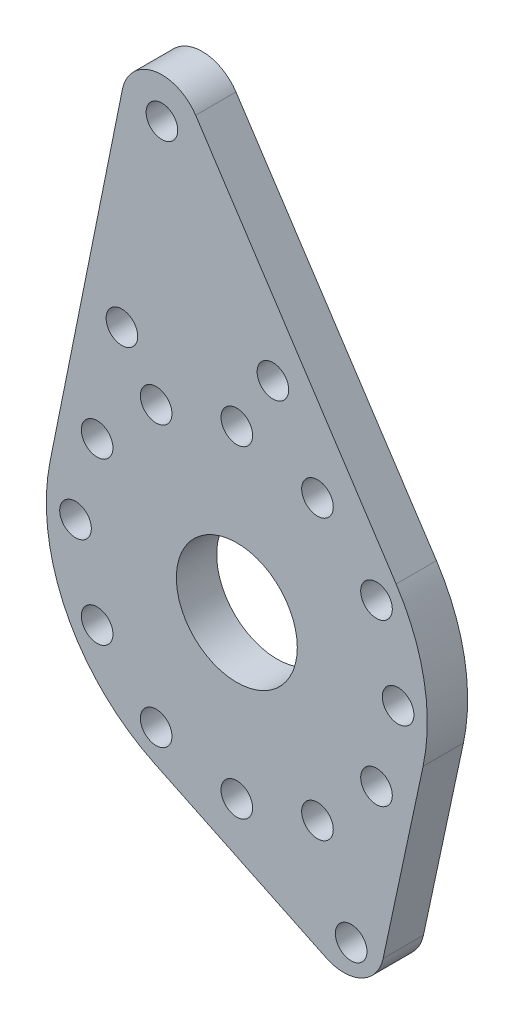
ISO-10303-21;
HEADER;
FILE_DESCRIPTION(('STEP AP214'),'2;1');
FILE_NAME('part.step','',(''),(''),'','','');
FILE_SCHEMA(('AUTOMOTIVE_DESIGN { 1 0 10303 214 1 1 1 1 }'));
ENDSEC;
DATA;
#1=APPLICATION_CONTEXT('core data for automotive mechanical design processes');
#2=APPLICATION_PROTOCOL_DEFINITION('international standard','automotive_design',2000,#1);
#3=PRODUCT_CONTEXT('',#1,'mechanical');
#4=PRODUCT('Part','Part','',(#3));
#5=PRODUCT_RELATED_PRODUCT_CATEGORY('part','',(#4));
#6=PRODUCT_DEFINITION_FORMATION('','',#4);
#7=PRODUCT_DEFINITION_CONTEXT('part definition',#1,'design');
#8=PRODUCT_DEFINITION('design','',#6,#7);
#9=PRODUCT_DEFINITION_SHAPE('','',#8);
#10=(LENGTH_UNIT() NAMED_UNIT(*) SI_UNIT(.MILLI.,.METRE.));
#11=(NAMED_UNIT(*) PLANE_ANGLE_UNIT() SI_UNIT($,.RADIAN.));
#12=(NAMED_UNIT(*) SI_UNIT($,.STERADIAN.) SOLID_ANGLE_UNIT());
#13=UNCERTAINTY_MEASURE_WITH_UNIT(LENGTH_MEASURE(1.E-05),#10,'distance_accuracy_value','');
#14=(GEOMETRIC_REPRESENTATION_CONTEXT(3) GLOBAL_UNCERTAINTY_ASSIGNED_CONTEXT((#13)) GLOBAL_UNIT_ASSIGNED_CONTEXT((#10,
#11,#12)) REPRESENTATION_CONTEXT('',''));
#15=CARTESIAN_POINT('',(0.,0.,0.));
#16=DIRECTION('',(0.,0.,1.));
#17=DIRECTION('',(1.,0.,0.));
#18=AXIS2_PLACEMENT_3D('',#15,#16,#17);
#19=CARTESIAN_POINT('',(323.538944933559,322.723784492421,6.35));
#20=DIRECTION('',(0.,0.,-1.));
#21=DIRECTION('',(-1.,0.,0.));
#22=AXIS2_PLACEMENT_3D('',#19,#20,#21);
#23=CYLINDRICAL_SURFACE('',#22,29.999999944);
#24=CARTESIAN_POINT('',(323.538944933559,322.723784492421,0.));
#25=DIRECTION('',(0.,0.,1.));
#26=DIRECTION('',(1.,0.,0.));
#27=AXIS2_PLACEMENT_3D('',#24,#25,#26);
#28=CIRCLE('',#27,29.999999944);
#29=CARTESIAN_POINT('',(352.872493449817,316.435467699804,0.));
#30=VERTEX_POINT('',#29);
#31=CARTESIAN_POINT('',(348.62500866221,339.176425716312,0.));
#32=VERTEX_POINT('',#31);
#33=EDGE_CURVE('E122',#30,#32,#28,.T.);
#34=ORIENTED_EDGE('',*,*,#33,.T.);
#35=DIRECTION('',(0.,0.,-1.));
#36=VECTOR('',#35,1.);
#37=CARTESIAN_POINT('',(348.62500866221,339.176425716312,6.35));
#38=LINE('',#37,#36);
#39=CARTESIAN_POINT('',(348.62500866221,339.176425716312,6.35));
#40=VERTEX_POINT('',#39);
#41=EDGE_CURVE('E105',#40,#32,#38,.T.);
#42=ORIENTED_EDGE('',*,*,#41,.F.);
#43=CARTESIAN_POINT('',(323.538944933559,322.723784492421,6.35));
#44=DIRECTION('',(0.,0.,1.));
#45=DIRECTION('',(1.,0.,0.));
#46=AXIS2_PLACEMENT_3D('',#43,#44,#45);
#47=CIRCLE('',#46,29.999999944);
#48=CARTESIAN_POINT('',(352.872493449817,316.435467699804,6.35));
#49=VERTEX_POINT('',#48);
#50=EDGE_CURVE('E108',#49,#40,#47,.T.);
#51=ORIENTED_EDGE('',*,*,#50,.F.);
#52=DIRECTION('',(0.,0.,-1.));
#53=VECTOR('',#52,1.);
#54=CARTESIAN_POINT('',(352.872493449817,316.435467699804,6.35));
#55=LINE('',#54,#53);
#56=EDGE_CURVE('E179',#49,#30,#55,.T.);
#57=ORIENTED_EDGE('',*,*,#56,.T.);
#58=EDGE_LOOP('',(#34,#42,#51,#57));
#59=FACE_BOUND('',#58,.T.);
#60=ADVANCED_FACE('F39',(#59),#23,.T.);
#61=CARTESIAN_POINT('',(399.313754526558,261.889071559946,6.35));
#62=DIRECTION('',(-0.836202125849281,-0.548421375153398,0.));
#63=DIRECTION('',(0.548421375153398,-0.836202125849281,0.));
#64=AXIS2_PLACEMENT_3D('',#61,#62,#63);
#65=PLANE('',#64);
#66=DIRECTION('',(-0.548421375153398,0.836202125849281,0.));
#67=VECTOR('',#66,1.);
#68=CARTESIAN_POINT('',(399.313754526558,261.889071559946,0.));
#69=LINE('',#68,#67);
#70=CARTESIAN_POINT('',(317.053464102312,387.314944514831,0.));
#71=VERTEX_POINT('',#70);
#72=EDGE_CURVE('E156',#32,#71,#69,.T.);
#73=ORIENTED_EDGE('',*,*,#72,.T.);
#74=DIRECTION('',(0.,0.,-1.));
#75=VECTOR('',#74,1.);
#76=CARTESIAN_POINT('',(317.053464102312,387.314944514831,6.35));
#77=LINE('',#76,#75);
#78=CARTESIAN_POINT('',(317.053464102312,387.314944514831,6.35));
#79=VERTEX_POINT('',#78);
#80=EDGE_CURVE('E11',#71,#79,#77,.F.);
#81=ORIENTED_EDGE('',*,*,#80,.T.);
#82=DIRECTION('',(-0.548421375153398,0.836202125849281,0.));
#83=VECTOR('',#82,1.);
#84=CARTESIAN_POINT('',(399.313754526558,261.889071559946,6.35));
#85=LINE('',#84,#83);
#86=EDGE_CURVE('E101',#40,#79,#85,.T.);
#87=ORIENTED_EDGE('',*,*,#86,.F.);
#88=ORIENTED_EDGE('',*,*,#41,.T.);
#89=EDGE_LOOP('',(#73,#81,#87,#88));
#90=FACE_BOUND('',#89,.T.);
#91=ADVANCED_FACE('F103',(#90),#65,.F.);
#92=CARTESIAN_POINT('',(218.896925037222,-44.1720425692418,6.35));
#93=DIRECTION('',(0.980241072412843,-0.197806572072113,0.));
#94=DIRECTION('',(0.197806572072113,0.980241072412843,0.));
#95=AXIS2_PLACEMENT_3D('',#92,#93,#94);
#96=PLANE('',#95);
#97=DIRECTION('',(-0.197806572072113,-0.980241072412843,0.));
#98=VECTOR('',#97,1.);
#99=CARTESIAN_POINT('',(218.896925037222,-44.1720425692418,6.35));
#100=LINE('',#99,#98);
#101=CARTESIAN_POINT('',(305.519049793347,385.088540515265,6.35));
#102=VERTEX_POINT('',#101);
#103=CARTESIAN_POINT('',(294.131712816067,328.657981643508,6.35));
#104=VERTEX_POINT('',#103);
#105=EDGE_CURVE('E107',#102,#104,#100,.T.);
#106=ORIENTED_EDGE('',*,*,#105,.F.);
#107=DIRECTION('',(0.,0.,-1.));
#108=VECTOR('',#107,1.);
#109=CARTESIAN_POINT('',(305.519049793347,385.088540515265,6.35));
#110=LINE('',#109,#108);
#111=CARTESIAN_POINT('',(305.519049793347,385.088540515265,0.));
#112=VERTEX_POINT('',#111);
#113=EDGE_CURVE('E47',#102,#112,#110,.T.);
#114=ORIENTED_EDGE('',*,*,#113,.T.);
#115=DIRECTION('',(-0.197806572072113,-0.980241072412843,0.));
#116=VECTOR('',#115,1.);
#117=CARTESIAN_POINT('',(218.896925037222,-44.1720425692418,0.));
#118=LINE('',#117,#116);
#119=CARTESIAN_POINT('',(294.131712816067,328.657981643508,0.));
#120=VERTEX_POINT('',#119);
#121=EDGE_CURVE('E147',#112,#120,#118,.T.);
#122=ORIENTED_EDGE('',*,*,#121,.T.);
#123=DIRECTION('',(0.,0.,-1.));
#124=VECTOR('',#123,1.);
#125=CARTESIAN_POINT('',(294.131712816067,328.657981643508,6.35));
#126=LINE('',#125,#124);
#127=EDGE_CURVE('E124',#104,#120,#126,.T.);
#128=ORIENTED_EDGE('',*,*,#127,.F.);
#129=EDGE_LOOP('',(#106,#114,#122,#128));
#130=FACE_BOUND('',#129,.T.);
#131=ADVANCED_FACE('F145',(#130),#96,.F.);
#132=CARTESIAN_POINT('',(310.545391155355,295.683674343738,0.));
#133=VERTEX_POINT('',#132);
#134=EDGE_CURVE('E155',#120,#133,#28,.T.);
#135=ORIENTED_EDGE('',*,*,#134,.T.);
#136=DIRECTION('',(0.,0.,-1.));
#137=VECTOR('',#136,1.);
#138=CARTESIAN_POINT('',(310.545391155355,295.683674343738,6.35));
#139=LINE('',#138,#137);
#140=CARTESIAN_POINT('',(310.545391155355,295.683674343738,6.35));
#141=VERTEX_POINT('',#140);
#142=EDGE_CURVE('E130',#141,#133,#139,.T.);
#143=ORIENTED_EDGE('',*,*,#142,.F.);
#144=EDGE_CURVE('E120',#104,#141,#47,.T.);
#145=ORIENTED_EDGE('',*,*,#144,.F.);
#146=ORIENTED_EDGE('',*,*,#127,.T.);
#147=EDGE_LOOP('',(#135,#143,#145,#146));
#148=FACE_BOUND('',#147,.T.);
#149=ADVANCED_FACE('F271',(#148),#23,.T.);
#150=CARTESIAN_POINT('',(173.686384045623,361.448379410905,6.35));
#151=DIRECTION('',(0.433118460081944,0.901337006638607,0.));
#152=DIRECTION('',(-0.901337006638607,0.433118460081944,0.));
#153=AXIS2_PLACEMENT_3D('',#150,#151,#152);
#154=PLANE('',#153);
#155=DIRECTION('',(0.901337006638607,-0.433118460081944,0.));
#156=VECTOR('',#155,1.);
#157=CARTESIAN_POINT('',(173.686384045623,361.448379410905,0.));
#158=LINE('',#157,#156);
#159=CARTESIAN_POINT('',(337.61749880468,282.674744842467,0.));
#160=VERTEX_POINT('',#159);
#161=EDGE_CURVE('E158',#133,#160,#158,.T.);
#162=ORIENTED_EDGE('',*,*,#161,.T.);
#163=DIRECTION('',(0.,0.,-1.));
#164=VECTOR('',#163,1.);
#165=CARTESIAN_POINT('',(337.61749880468,282.674744842467,6.35));
#166=LINE('',#165,#164);
#167=CARTESIAN_POINT('',(337.61749880468,282.674744842467,6.35));
#168=VERTEX_POINT('',#167);
#169=EDGE_CURVE('E137',#160,#168,#166,.F.);
#170=ORIENTED_EDGE('',*,*,#169,.T.);
#171=DIRECTION('',(0.901337006638607,-0.433118460081944,0.));
#172=VECTOR('',#171,1.);
#173=CARTESIAN_POINT('',(173.686384045623,361.448379410905,6.35));
#174=LINE('',#173,#172);
#175=EDGE_CURVE('E187',#141,#168,#174,.T.);
#176=ORIENTED_EDGE('',*,*,#175,.F.);
#177=ORIENTED_EDGE('',*,*,#142,.T.);
#178=EDGE_LOOP('',(#162,#170,#176,#177));
#179=FACE_BOUND('',#178,.T.);
#180=ADVANCED_FACE('F185',(#179),#154,.F.);
#181=CARTESIAN_POINT('',(305.439653657188,352.593020845116,6.35));
#182=DIRECTION('',(0.,0.,-1.));
#183=DIRECTION('',(-1.,0.,0.));
#184=AXIS2_PLACEMENT_3D('',#181,#182,#183);
#185=CYLINDRICAL_SURFACE('',#184,2.48920000000001);
#186=CARTESIAN_POINT('',(305.439653657188,352.593020845116,6.35));
#187=DIRECTION('',(0.,0.,1.));
#188=DIRECTION('',(1.,0.,0.));
#189=AXIS2_PLACEMENT_3D('',#186,#187,#188);
#190=CIRCLE('',#189,2.48920000000001);
#191=CARTESIAN_POINT('',(307.928853657188,352.593020845116,6.35));
#192=VERTEX_POINT('',#191);
#193=EDGE_CURVE('E207',#192,#192,#190,.T.);
#194=ORIENTED_EDGE('',*,*,#193,.T.);
#195=EDGE_LOOP('',(#194));
#196=FACE_BOUND('',#195,.T.);
#197=CARTESIAN_POINT('',(305.439653657188,352.593020845116,0.));
#198=DIRECTION('',(0.,0.,1.));
#199=DIRECTION('',(1.,0.,0.));
#200=AXIS2_PLACEMENT_3D('',#197,#198,#199);
#201=CIRCLE('',#200,2.48920000000001);
#202=CARTESIAN_POINT('',(307.928853657188,352.593020845116,0.));
#203=VERTEX_POINT('',#202);
#204=EDGE_CURVE('E172',#203,#203,#201,.T.);
#205=ORIENTED_EDGE('',*,*,#204,.F.);
#206=EDGE_LOOP('',(#205));
#207=FACE_BOUND('',#206,.T.);
#208=ADVANCED_FACE('F282',(#196,#207),#185,.F.);
#209=CARTESIAN_POINT('',(311.743580603169,383.832468782608,6.35));
#210=DIRECTION('',(0.,0.,-1.));
#211=DIRECTION('',(-1.,0.,0.));
#212=AXIS2_PLACEMENT_3D('',#209,#210,#211);
#213=CYLINDRICAL_SURFACE('',#212,2.48919999999997);
#214=CARTESIAN_POINT('',(311.743580603169,383.832468782608,6.35));
#215=DIRECTION('',(0.,0.,1.));
#216=DIRECTION('',(1.,0.,0.));
#217=AXIS2_PLACEMENT_3D('',#214,#215,#216);
#218=CIRCLE('',#217,2.48919999999997);
#219=CARTESIAN_POINT('',(314.232780603169,383.832468782608,6.35));
#220=VERTEX_POINT('',#219);
#221=EDGE_CURVE('E200',#220,#220,#218,.T.);
#222=ORIENTED_EDGE('',*,*,#221,.T.);
#223=EDGE_LOOP('',(#222));
#224=FACE_BOUND('',#223,.T.);
#225=CARTESIAN_POINT('',(311.743580603169,383.832468782608,0.));
#226=DIRECTION('',(0.,0.,1.));
#227=DIRECTION('',(1.,0.,0.));
#228=AXIS2_PLACEMENT_3D('',#225,#226,#227);
#229=CIRCLE('',#228,2.48919999999997);
#230=CARTESIAN_POINT('',(314.232780603169,383.832468782608,0.));
#231=VERTEX_POINT('',#230);
#232=EDGE_CURVE('E169',#231,#231,#229,.T.);
#233=ORIENTED_EDGE('',*,*,#232,.F.);
#234=EDGE_LOOP('',(#233));
#235=FACE_BOUND('',#234,.T.);
#236=ADVANCED_FACE('F367',(#224,#235),#213,.F.);
#237=CARTESIAN_POINT('',(341.544957029956,286.730386981231,6.35));
#238=DIRECTION('',(0.,0.,-1.));
#239=DIRECTION('',(-1.,0.,0.));
#240=AXIS2_PLACEMENT_3D('',#237,#238,#239);
#241=CYLINDRICAL_SURFACE('',#240,2.48920000000001);
#242=CARTESIAN_POINT('',(341.544957029956,286.730386981231,6.35));
#243=DIRECTION('',(0.,0.,1.));
#244=DIRECTION('',(1.,0.,0.));
#245=AXIS2_PLACEMENT_3D('',#242,#243,#244);
#246=CIRCLE('',#245,2.48920000000001);
#247=CARTESIAN_POINT('',(344.034157029956,286.730386981231,6.35));
#248=VERTEX_POINT('',#247);
#249=EDGE_CURVE('E197',#248,#248,#246,.T.);
#250=ORIENTED_EDGE('',*,*,#249,.T.);
#251=EDGE_LOOP('',(#250));
#252=FACE_BOUND('',#251,.T.);
#253=CARTESIAN_POINT('',(341.544957029956,286.730386981231,0.));
#254=DIRECTION('',(0.,0.,1.));
#255=DIRECTION('',(1.,0.,0.));
#256=AXIS2_PLACEMENT_3D('',#253,#254,#255);
#257=CIRCLE('',#256,2.48920000000001);
#258=CARTESIAN_POINT('',(344.034157029956,286.730386981231,0.));
#259=VERTEX_POINT('',#258);
#260=EDGE_CURVE('E166',#259,#259,#257,.T.);
#261=ORIENTED_EDGE('',*,*,#260,.F.);
#262=EDGE_LOOP('',(#261));
#263=FACE_BOUND('',#262,.T.);
#264=ADVANCED_FACE('F265',(#252,#263),#241,.F.);
#265=CARTESIAN_POINT('',(272.513749303501,-58.4195527866133,6.35));
#266=DIRECTION('',(0.977784952367148,-0.209610560145175,0.));
#267=DIRECTION('',(0.209610560145175,0.977784952367148,0.));
#268=AXIS2_PLACEMENT_3D('',#265,#266,#267);
#269=PLANE('',#268);
#270=DIRECTION('',(-0.209610560145175,-0.977784952367148,0.));
#271=VECTOR('',#270,1.);
#272=CARTESIAN_POINT('',(272.513749303501,-58.4195527866133,6.35));
#273=LINE('',#272,#271);
#274=CARTESIAN_POINT('',(346.576735473732,287.0672077777,6.35));
#275=VERTEX_POINT('',#274);
#276=EDGE_CURVE('E116',#49,#275,#273,.T.);
#277=ORIENTED_EDGE('',*,*,#276,.T.);
#278=DIRECTION('',(0.,0.,-1.));
#279=VECTOR('',#278,1.);
#280=CARTESIAN_POINT('',(346.576735473732,287.0672077777,0.));
#281=LINE('',#280,#279);
#282=CARTESIAN_POINT('',(346.576735473732,287.0672077777,0.));
#283=VERTEX_POINT('',#282);
#284=EDGE_CURVE('E123',#275,#283,#281,.T.);
#285=ORIENTED_EDGE('',*,*,#284,.T.);
#286=DIRECTION('',(-0.209610560145175,-0.977784952367148,0.));
#287=VECTOR('',#286,1.);
#288=CARTESIAN_POINT('',(272.513749303501,-58.4195527866133,0.));
#289=LINE('',#288,#287);
#290=EDGE_CURVE('E164',#30,#283,#289,.T.);
#291=ORIENTED_EDGE('',*,*,#290,.F.);
#292=ORIENTED_EDGE('',*,*,#56,.F.);
#293=EDGE_LOOP('',(#277,#285,#291,#292));
#294=FACE_BOUND('',#293,.T.);
#295=ADVANCED_FACE('F196',(#294),#269,.T.);
#296=CARTESIAN_POINT('',(323.538944933559,348.123784492421,6.35));
#297=DIRECTION('',(0.,0.,-1.));
#298=DIRECTION('',(-1.,0.,0.));
#299=AXIS2_PLACEMENT_3D('',#296,#297,#298);
#300=CYLINDRICAL_SURFACE('',#299,2.48920000000001);
#301=CARTESIAN_POINT('',(323.538944933559,348.123784492421,6.35));
#302=DIRECTION('',(0.,0.,1.));
#303=DIRECTION('',(1.,0.,0.));
#304=AXIS2_PLACEMENT_3D('',#301,#302,#303);
#305=CIRCLE('',#304,2.48920000000001);
#306=CARTESIAN_POINT('',(326.028144933559,348.123784492421,6.35));
#307=VERTEX_POINT('',#306);
#308=EDGE_CURVE('E118',#307,#307,#305,.T.);
#309=ORIENTED_EDGE('',*,*,#308,.T.);
#310=EDGE_LOOP('',(#309));
#311=FACE_BOUND('',#310,.T.);
#312=CARTESIAN_POINT('',(323.538944933559,348.123784492421,0.));
#313=DIRECTION('',(0.,0.,1.));
#314=DIRECTION('',(1.,0.,0.));
#315=AXIS2_PLACEMENT_3D('',#312,#313,#314);
#316=CIRCLE('',#315,2.48920000000001);
#317=CARTESIAN_POINT('',(326.028144933559,348.123784492421,0.));
#318=VERTEX_POINT('',#317);
#319=EDGE_CURVE('E248',#318,#318,#316,.T.);
#320=ORIENTED_EDGE('',*,*,#319,.F.);
#321=EDGE_LOOP('',(#320));
#322=FACE_BOUND('',#321,.T.);
#323=ADVANCED_FACE('F253',(#311,#322),#300,.F.);
#324=CARTESIAN_POINT('',(336.238944933558,344.720829748546,6.35));
#325=DIRECTION('',(0.,0.,-1.));
#326=DIRECTION('',(-1.,0.,0.));
#327=AXIS2_PLACEMENT_3D('',#324,#325,#326);
#328=CYLINDRICAL_SURFACE('',#327,2.48920000000001);
#329=CARTESIAN_POINT('',(336.238944933558,344.720829748546,6.35));
#330=DIRECTION('',(0.,0.,1.));
#331=DIRECTION('',(1.,0.,0.));
#332=AXIS2_PLACEMENT_3D('',#329,#330,#331);
#333=CIRCLE('',#332,2.48920000000001);
#334=CARTESIAN_POINT('',(338.728144933558,344.720829748546,6.35));
#335=VERTEX_POINT('',#334);
#336=EDGE_CURVE('E285',#335,#335,#333,.T.);
#337=ORIENTED_EDGE('',*,*,#336,.T.);
#338=EDGE_LOOP('',(#337));
#339=FACE_BOUND('',#338,.T.);
#340=CARTESIAN_POINT('',(336.238944933558,344.720829748546,0.));
#341=DIRECTION('',(0.,0.,1.));
#342=DIRECTION('',(1.,0.,0.));
#343=AXIS2_PLACEMENT_3D('',#340,#341,#342);
#344=CIRCLE('',#343,2.48920000000001);
#345=CARTESIAN_POINT('',(338.728144933558,344.720829748546,0.));
#346=VERTEX_POINT('',#345);
#347=EDGE_CURVE('E245',#346,#346,#344,.T.);
#348=ORIENTED_EDGE('',*,*,#347,.F.);
#349=EDGE_LOOP('',(#348));
#350=FACE_BOUND('',#349,.T.);
#351=ADVANCED_FACE('F255',(#339,#350),#328,.F.);
#352=CARTESIAN_POINT('',(345.535990189683,335.423784492421,6.35));
#353=DIRECTION('',(0.,0.,-1.));
#354=DIRECTION('',(-1.,0.,0.));
#355=AXIS2_PLACEMENT_3D('',#352,#353,#354);
#356=CYLINDRICAL_SURFACE('',#355,2.48919999999995);
#357=CARTESIAN_POINT('',(345.535990189683,335.423784492421,6.35));
#358=DIRECTION('',(0.,0.,1.));
#359=DIRECTION('',(1.,0.,0.));
#360=AXIS2_PLACEMENT_3D('',#357,#358,#359);
#361=CIRCLE('',#360,2.48919999999995);
#362=CARTESIAN_POINT('',(348.025190189683,335.423784492421,6.35));
#363=VERTEX_POINT('',#362);
#364=EDGE_CURVE('E288',#363,#363,#361,.T.);
#365=ORIENTED_EDGE('',*,*,#364,.T.);
#366=EDGE_LOOP('',(#365));
#367=FACE_BOUND('',#366,.T.);
#368=CARTESIAN_POINT('',(345.535990189683,335.423784492421,0.));
#369=DIRECTION('',(0.,0.,1.));
#370=DIRECTION('',(1.,0.,0.));
#371=AXIS2_PLACEMENT_3D('',#368,#369,#370);
#372=CIRCLE('',#371,2.48919999999995);
#373=CARTESIAN_POINT('',(348.025190189683,335.423784492421,0.));
#374=VERTEX_POINT('',#373);
#375=EDGE_CURVE('E242',#374,#374,#372,.T.);
#376=ORIENTED_EDGE('',*,*,#375,.F.);
#377=EDGE_LOOP('',(#376));
#378=FACE_BOUND('',#377,.T.);
#379=ADVANCED_FACE('F262',(#367,#378),#356,.F.);
#380=CARTESIAN_POINT('',(348.938944933558,322.723784492421,6.35));
#381=DIRECTION('',(0.,0.,-1.));
#382=DIRECTION('',(-1.,0.,0.));
#383=AXIS2_PLACEMENT_3D('',#380,#381,#382);
#384=CYLINDRICAL_SURFACE('',#383,2.48919999999995);
#385=CARTESIAN_POINT('',(348.938944933558,322.723784492421,6.35));
#386=DIRECTION('',(0.,0.,1.));
#387=DIRECTION('',(1.,0.,0.));
#388=AXIS2_PLACEMENT_3D('',#385,#386,#387);
#389=CIRCLE('',#388,2.48919999999995);
#390=CARTESIAN_POINT('',(351.428144933558,322.723784492421,6.35));
#391=VERTEX_POINT('',#390);
#392=EDGE_CURVE('E291',#391,#391,#389,.T.);
#393=ORIENTED_EDGE('',*,*,#392,.T.);
#394=EDGE_LOOP('',(#393));
#395=FACE_BOUND('',#394,.T.);
#396=CARTESIAN_POINT('',(348.938944933558,322.723784492421,0.));
#397=DIRECTION('',(0.,0.,1.));
#398=DIRECTION('',(1.,0.,0.));
#399=AXIS2_PLACEMENT_3D('',#396,#397,#398);
#400=CIRCLE('',#399,2.48919999999995);
#401=CARTESIAN_POINT('',(351.428144933558,322.723784492421,0.));
#402=VERTEX_POINT('',#401);
#403=EDGE_CURVE('E239',#402,#402,#400,.T.);
#404=ORIENTED_EDGE('',*,*,#403,.F.);
#405=EDGE_LOOP('',(#404));
#406=FACE_BOUND('',#405,.T.);
#407=ADVANCED_FACE('F539',(#395,#406),#384,.F.);
#408=CARTESIAN_POINT('',(345.535990189683,310.023784492421,6.35));
#409=DIRECTION('',(0.,0.,-1.));
#410=DIRECTION('',(-1.,0.,0.));
#411=AXIS2_PLACEMENT_3D('',#408,#409,#410);
#412=CYLINDRICAL_SURFACE('',#411,2.48920000000001);
#413=CARTESIAN_POINT('',(345.535990189683,310.023784492421,6.35));
#414=DIRECTION('',(0.,0.,1.));
#415=DIRECTION('',(1.,0.,0.));
#416=AXIS2_PLACEMENT_3D('',#413,#414,#415);
#417=CIRCLE('',#416,2.48920000000001);
#418=CARTESIAN_POINT('',(348.025190189683,310.023784492421,6.35));
#419=VERTEX_POINT('',#418);
#420=EDGE_CURVE('E294',#419,#419,#417,.T.);
#421=ORIENTED_EDGE('',*,*,#420,.T.);
#422=EDGE_LOOP('',(#421));
#423=FACE_BOUND('',#422,.T.);
#424=CARTESIAN_POINT('',(345.535990189683,310.023784492421,0.));
#425=DIRECTION('',(0.,0.,1.));
#426=DIRECTION('',(1.,0.,0.));
#427=AXIS2_PLACEMENT_3D('',#424,#425,#426);
#428=CIRCLE('',#427,2.48920000000001);
#429=CARTESIAN_POINT('',(348.025190189683,310.023784492421,0.));
#430=VERTEX_POINT('',#429);
#431=EDGE_CURVE('E236',#430,#430,#428,.T.);
#432=ORIENTED_EDGE('',*,*,#431,.F.);
#433=EDGE_LOOP('',(#432));
#434=FACE_BOUND('',#433,.T.);
#435=ADVANCED_FACE('F529',(#423,#434),#412,.F.);
#436=CARTESIAN_POINT('',(336.238944933558,300.726739236297,6.35));
#437=DIRECTION('',(0.,0.,-1.));
#438=DIRECTION('',(-1.,0.,0.));
#439=AXIS2_PLACEMENT_3D('',#436,#437,#438);
#440=CYLINDRICAL_SURFACE('',#439,2.48919999999995);
#441=CARTESIAN_POINT('',(336.238944933558,300.726739236297,6.35));
#442=DIRECTION('',(0.,0.,1.));
#443=DIRECTION('',(1.,0.,0.));
#444=AXIS2_PLACEMENT_3D('',#441,#442,#443);
#445=CIRCLE('',#444,2.48919999999995);
#446=CARTESIAN_POINT('',(338.728144933558,300.726739236297,6.35));
#447=VERTEX_POINT('',#446);
#448=EDGE_CURVE('E297',#447,#447,#445,.T.);
#449=ORIENTED_EDGE('',*,*,#448,.T.);
#450=EDGE_LOOP('',(#449));
#451=FACE_BOUND('',#450,.T.);
#452=CARTESIAN_POINT('',(336.238944933558,300.726739236297,0.));
#453=DIRECTION('',(0.,0.,1.));
#454=DIRECTION('',(1.,0.,0.));
#455=AXIS2_PLACEMENT_3D('',#452,#453,#454);
#456=CIRCLE('',#455,2.48919999999995);
#457=CARTESIAN_POINT('',(338.728144933558,300.726739236297,0.));
#458=VERTEX_POINT('',#457);
#459=EDGE_CURVE('E233',#458,#458,#456,.T.);
#460=ORIENTED_EDGE('',*,*,#459,.F.);
#461=EDGE_LOOP('',(#460));
#462=FACE_BOUND('',#461,.T.);
#463=ADVANCED_FACE('F519',(#451,#462),#440,.F.);
#464=CARTESIAN_POINT('',(323.538944933559,297.323784492421,6.35));
#465=DIRECTION('',(0.,0.,-1.));
#466=DIRECTION('',(-1.,0.,0.));
#467=AXIS2_PLACEMENT_3D('',#464,#465,#466);
#468=CYLINDRICAL_SURFACE('',#467,2.48920000000001);
#469=CARTESIAN_POINT('',(323.538944933559,297.323784492421,6.35));
#470=DIRECTION('',(0.,0.,1.));
#471=DIRECTION('',(1.,0.,0.));
#472=AXIS2_PLACEMENT_3D('',#469,#470,#471);
#473=CIRCLE('',#472,2.48920000000001);
#474=CARTESIAN_POINT('',(326.028144933559,297.323784492421,6.35));
#475=VERTEX_POINT('',#474);
#476=EDGE_CURVE('E300',#475,#475,#473,.T.);
#477=ORIENTED_EDGE('',*,*,#476,.T.);
#478=EDGE_LOOP('',(#477));
#479=FACE_BOUND('',#478,.T.);
#480=CARTESIAN_POINT('',(323.538944933559,297.323784492421,0.));
#481=DIRECTION('',(0.,0.,1.));
#482=DIRECTION('',(1.,0.,0.));
#483=AXIS2_PLACEMENT_3D('',#480,#481,#482);
#484=CIRCLE('',#483,2.48920000000001);
#485=CARTESIAN_POINT('',(326.028144933559,297.323784492421,0.));
#486=VERTEX_POINT('',#485);
#487=EDGE_CURVE('E230',#486,#486,#484,.T.);
#488=ORIENTED_EDGE('',*,*,#487,.F.);
#489=EDGE_LOOP('',(#488));
#490=FACE_BOUND('',#489,.T.);
#491=ADVANCED_FACE('F509',(#479,#490),#468,.F.);
#492=CARTESIAN_POINT('',(310.838944933559,300.726739236297,6.35));
#493=DIRECTION('',(0.,0.,-1.));
#494=DIRECTION('',(-1.,0.,0.));
#495=AXIS2_PLACEMENT_3D('',#492,#493,#494);
#496=CYLINDRICAL_SURFACE('',#495,2.48919999999995);
#497=CARTESIAN_POINT('',(310.838944933559,300.726739236297,6.35));
#498=DIRECTION('',(0.,0.,1.));
#499=DIRECTION('',(1.,0.,0.));
#500=AXIS2_PLACEMENT_3D('',#497,#498,#499);
#501=CIRCLE('',#500,2.48919999999995);
#502=CARTESIAN_POINT('',(313.328144933559,300.726739236297,6.35));
#503=VERTEX_POINT('',#502);
#504=EDGE_CURVE('E303',#503,#503,#501,.T.);
#505=ORIENTED_EDGE('',*,*,#504,.T.);
#506=EDGE_LOOP('',(#505));
#507=FACE_BOUND('',#506,.T.);
#508=CARTESIAN_POINT('',(310.838944933559,300.726739236297,0.));
#509=DIRECTION('',(0.,0.,1.));
#510=DIRECTION('',(1.,0.,0.));
#511=AXIS2_PLACEMENT_3D('',#508,#509,#510);
#512=CIRCLE('',#511,2.48919999999995);
#513=CARTESIAN_POINT('',(313.328144933559,300.726739236297,0.));
#514=VERTEX_POINT('',#513);
#515=EDGE_CURVE('E227',#514,#514,#512,.T.);
#516=ORIENTED_EDGE('',*,*,#515,.F.);
#517=EDGE_LOOP('',(#516));
#518=FACE_BOUND('',#517,.T.);
#519=ADVANCED_FACE('F499',(#507,#518),#496,.F.);
#520=CARTESIAN_POINT('',(301.541899677434,310.023784492421,6.35));
#521=DIRECTION('',(0.,0.,-1.));
#522=DIRECTION('',(-1.,0.,0.));
#523=AXIS2_PLACEMENT_3D('',#520,#521,#522);
#524=CYLINDRICAL_SURFACE('',#523,2.48920000000001);
#525=CARTESIAN_POINT('',(301.541899677434,310.023784492421,6.35));
#526=DIRECTION('',(0.,0.,1.));
#527=DIRECTION('',(1.,0.,0.));
#528=AXIS2_PLACEMENT_3D('',#525,#526,#527);
#529=CIRCLE('',#528,2.48920000000001);
#530=CARTESIAN_POINT('',(304.031099677434,310.023784492421,6.35));
#531=VERTEX_POINT('',#530);
#532=EDGE_CURVE('E306',#531,#531,#529,.T.);
#533=ORIENTED_EDGE('',*,*,#532,.T.);
#534=EDGE_LOOP('',(#533));
#535=FACE_BOUND('',#534,.T.);
#536=CARTESIAN_POINT('',(301.541899677434,310.023784492421,0.));
#537=DIRECTION('',(0.,0.,1.));
#538=DIRECTION('',(1.,0.,0.));
#539=AXIS2_PLACEMENT_3D('',#536,#537,#538);
#540=CIRCLE('',#539,2.48920000000001);
#541=CARTESIAN_POINT('',(304.031099677434,310.023784492421,0.));
#542=VERTEX_POINT('',#541);
#543=EDGE_CURVE('E224',#542,#542,#540,.T.);
#544=ORIENTED_EDGE('',*,*,#543,.F.);
#545=EDGE_LOOP('',(#544));
#546=FACE_BOUND('',#545,.T.);
#547=ADVANCED_FACE('F489',(#535,#546),#524,.F.);
#548=CARTESIAN_POINT('',(298.138944933558,322.723784492421,6.35));
#549=DIRECTION('',(0.,0.,-1.));
#550=DIRECTION('',(-1.,0.,0.));
#551=AXIS2_PLACEMENT_3D('',#548,#549,#550);
#552=CYLINDRICAL_SURFACE('',#551,2.48919999999995);
#553=CARTESIAN_POINT('',(298.138944933558,322.723784492421,6.35));
#554=DIRECTION('',(0.,0.,1.));
#555=DIRECTION('',(1.,0.,0.));
#556=AXIS2_PLACEMENT_3D('',#553,#554,#555);
#557=CIRCLE('',#556,2.48919999999995);
#558=CARTESIAN_POINT('',(300.628144933558,322.723784492421,6.35));
#559=VERTEX_POINT('',#558);
#560=EDGE_CURVE('E309',#559,#559,#557,.T.);
#561=ORIENTED_EDGE('',*,*,#560,.T.);
#562=EDGE_LOOP('',(#561));
#563=FACE_BOUND('',#562,.T.);
#564=CARTESIAN_POINT('',(298.138944933558,322.723784492421,0.));
#565=DIRECTION('',(0.,0.,1.));
#566=DIRECTION('',(1.,0.,0.));
#567=AXIS2_PLACEMENT_3D('',#564,#565,#566);
#568=CIRCLE('',#567,2.48919999999995);
#569=CARTESIAN_POINT('',(300.628144933558,322.723784492421,0.));
#570=VERTEX_POINT('',#569);
#571=EDGE_CURVE('E221',#570,#570,#568,.T.);
#572=ORIENTED_EDGE('',*,*,#571,.F.);
#573=EDGE_LOOP('',(#572));
#574=FACE_BOUND('',#573,.T.);
#575=ADVANCED_FACE('F479',(#563,#574),#552,.F.);
#576=CARTESIAN_POINT('',(301.541899677434,335.423784492421,6.35));
#577=DIRECTION('',(0.,0.,-1.));
#578=DIRECTION('',(-1.,0.,0.));
#579=AXIS2_PLACEMENT_3D('',#576,#577,#578);
#580=CYLINDRICAL_SURFACE('',#579,2.48920000000001);
#581=CARTESIAN_POINT('',(301.541899677434,335.423784492421,6.35));
#582=DIRECTION('',(0.,0.,1.));
#583=DIRECTION('',(1.,0.,0.));
#584=AXIS2_PLACEMENT_3D('',#581,#582,#583);
#585=CIRCLE('',#584,2.48920000000001);
#586=CARTESIAN_POINT('',(304.031099677434,335.423784492421,6.35));
#587=VERTEX_POINT('',#586);
#588=EDGE_CURVE('E312',#587,#587,#585,.T.);
#589=ORIENTED_EDGE('',*,*,#588,.T.);
#590=EDGE_LOOP('',(#589));
#591=FACE_BOUND('',#590,.T.);
#592=CARTESIAN_POINT('',(301.541899677434,335.423784492421,0.));
#593=DIRECTION('',(0.,0.,1.));
#594=DIRECTION('',(1.,0.,0.));
#595=AXIS2_PLACEMENT_3D('',#592,#593,#594);
#596=CIRCLE('',#595,2.48920000000001);
#597=CARTESIAN_POINT('',(304.031099677434,335.423784492421,0.));
#598=VERTEX_POINT('',#597);
#599=EDGE_CURVE('E218',#598,#598,#596,.T.);
#600=ORIENTED_EDGE('',*,*,#599,.F.);
#601=EDGE_LOOP('',(#600));
#602=FACE_BOUND('',#601,.T.);
#603=ADVANCED_FACE('F469',(#591,#602),#580,.F.);
#604=CARTESIAN_POINT('',(310.838944933559,344.720829748546,6.35));
#605=DIRECTION('',(0.,0.,-1.));
#606=DIRECTION('',(-1.,0.,0.));
#607=AXIS2_PLACEMENT_3D('',#604,#605,#606);
#608=CYLINDRICAL_SURFACE('',#607,2.48919999999983);
#609=CARTESIAN_POINT('',(310.838944933559,344.720829748546,6.35));
#610=DIRECTION('',(0.,0.,1.));
#611=DIRECTION('',(1.,0.,0.));
#612=AXIS2_PLACEMENT_3D('',#609,#610,#611);
#613=CIRCLE('',#612,2.48919999999983);
#614=CARTESIAN_POINT('',(313.328144933558,344.720829748546,6.35));
#615=VERTEX_POINT('',#614);
#616=EDGE_CURVE('E315',#615,#615,#613,.T.);
#617=ORIENTED_EDGE('',*,*,#616,.T.);
#618=EDGE_LOOP('',(#617));
#619=FACE_BOUND('',#618,.T.);
#620=CARTESIAN_POINT('',(310.838944933559,344.720829748546,0.));
#621=DIRECTION('',(0.,0.,1.));
#622=DIRECTION('',(1.,0.,0.));
#623=AXIS2_PLACEMENT_3D('',#620,#621,#622);
#624=CIRCLE('',#623,2.48919999999983);
#625=CARTESIAN_POINT('',(313.328144933558,344.720829748546,0.));
#626=VERTEX_POINT('',#625);
#627=EDGE_CURVE('E215',#626,#626,#624,.T.);
#628=ORIENTED_EDGE('',*,*,#627,.F.);
#629=EDGE_LOOP('',(#628));
#630=FACE_BOUND('',#629,.T.);
#631=ADVANCED_FACE('F460',(#619,#630),#608,.F.);
#632=CARTESIAN_POINT('',(323.538944933559,322.723784492421,6.35));
#633=DIRECTION('',(0.,0.,-1.));
#634=DIRECTION('',(-1.,0.,0.));
#635=AXIS2_PLACEMENT_3D('',#632,#633,#634);
#636=CYLINDRICAL_SURFACE('',#635,9.52500000000002);
#637=CARTESIAN_POINT('',(323.538944933559,322.723784492421,6.35));
#638=DIRECTION('',(0.,0.,1.));
#639=DIRECTION('',(1.,0.,0.));
#640=AXIS2_PLACEMENT_3D('',#637,#638,#639);
#641=CIRCLE('',#640,9.52500000000002);
#642=CARTESIAN_POINT('',(333.063944933559,322.723784492421,6.35));
#643=VERTEX_POINT('',#642);
#644=EDGE_CURVE('E178',#643,#643,#641,.T.);
#645=ORIENTED_EDGE('',*,*,#644,.T.);
#646=EDGE_LOOP('',(#645));
#647=FACE_BOUND('',#646,.T.);
#648=CARTESIAN_POINT('',(323.538944933559,322.723784492421,0.));
#649=DIRECTION('',(0.,0.,1.));
#650=DIRECTION('',(1.,0.,0.));
#651=AXIS2_PLACEMENT_3D('',#648,#649,#650);
#652=CIRCLE('',#651,9.52500000000002);
#653=CARTESIAN_POINT('',(333.063944933559,322.723784492421,0.));
#654=VERTEX_POINT('',#653);
#655=EDGE_CURVE('E212',#654,#654,#652,.T.);
#656=ORIENTED_EDGE('',*,*,#655,.F.);
#657=EDGE_LOOP('',(#656));
#658=FACE_BOUND('',#657,.T.);
#659=ADVANCED_FACE('F321',(#647,#658),#636,.F.);
#660=CARTESIAN_POINT('',(329.22130264428,357.183419369294,6.35));
#661=DIRECTION('',(0.,0.,-1.));
#662=DIRECTION('',(-1.,0.,0.));
#663=AXIS2_PLACEMENT_3D('',#660,#661,#662);
#664=CYLINDRICAL_SURFACE('',#663,2.48920000000006);
#665=CARTESIAN_POINT('',(329.22130264428,357.183419369294,6.35));
#666=DIRECTION('',(0.,0.,1.));
#667=DIRECTION('',(1.,0.,0.));
#668=AXIS2_PLACEMENT_3D('',#665,#666,#667);
#669=CIRCLE('',#668,2.48920000000006);
#670=CARTESIAN_POINT('',(331.71050264428,357.183419369294,6.35));
#671=VERTEX_POINT('',#670);
#672=EDGE_CURVE('E180',#671,#671,#669,.T.);
#673=ORIENTED_EDGE('',*,*,#672,.T.);
#674=EDGE_LOOP('',(#673));
#675=FACE_BOUND('',#674,.T.);
#676=CARTESIAN_POINT('',(329.22130264428,357.183419369294,0.));
#677=DIRECTION('',(0.,0.,1.));
#678=DIRECTION('',(1.,0.,0.));
#679=AXIS2_PLACEMENT_3D('',#676,#677,#678);
#680=CIRCLE('',#679,2.48920000000006);
#681=CARTESIAN_POINT('',(331.71050264428,357.183419369294,0.));
#682=VERTEX_POINT('',#681);
#683=EDGE_CURVE('E175',#682,#682,#680,.T.);
#684=ORIENTED_EDGE('',*,*,#683,.F.);
#685=EDGE_LOOP('',(#684));
#686=FACE_BOUND('',#685,.T.);
#687=ADVANCED_FACE('F326',(#675,#686),#664,.F.);
#688=CARTESIAN_POINT('',(0.,0.,6.35));
#689=DIRECTION('',(0.,0.,1.));
#690=DIRECTION('',(1.,0.,0.));
#691=AXIS2_PLACEMENT_3D('',#688,#689,#690);
#692=PLANE('',#691);
#693=ORIENTED_EDGE('',*,*,#644,.F.);
#694=EDGE_LOOP('',(#693));
#695=FACE_BOUND('',#694,.T.);
#696=ORIENTED_EDGE('',*,*,#616,.F.);
#697=EDGE_LOOP('',(#696));
#698=FACE_BOUND('',#697,.T.);
#699=ORIENTED_EDGE('',*,*,#588,.F.);
#700=EDGE_LOOP('',(#699));
#701=FACE_BOUND('',#700,.T.);
#702=ORIENTED_EDGE('',*,*,#560,.F.);
#703=EDGE_LOOP('',(#702));
#704=FACE_BOUND('',#703,.T.);
#705=ORIENTED_EDGE('',*,*,#532,.F.);
#706=EDGE_LOOP('',(#705));
#707=FACE_BOUND('',#706,.T.);
#708=ORIENTED_EDGE('',*,*,#504,.F.);
#709=EDGE_LOOP('',(#708));
#710=FACE_BOUND('',#709,.T.);
#711=ORIENTED_EDGE('',*,*,#476,.F.);
#712=EDGE_LOOP('',(#711));
#713=FACE_BOUND('',#712,.T.);
#714=ORIENTED_EDGE('',*,*,#448,.F.);
#715=EDGE_LOOP('',(#714));
#716=FACE_BOUND('',#715,.T.);
#717=ORIENTED_EDGE('',*,*,#420,.F.);
#718=EDGE_LOOP('',(#717));
#719=FACE_BOUND('',#718,.T.);
#720=ORIENTED_EDGE('',*,*,#392,.F.);
#721=EDGE_LOOP('',(#720));
#722=FACE_BOUND('',#721,.T.);
#723=ORIENTED_EDGE('',*,*,#364,.F.);
#724=EDGE_LOOP('',(#723));
#725=FACE_BOUND('',#724,.T.);
#726=ORIENTED_EDGE('',*,*,#336,.F.);
#727=EDGE_LOOP('',(#726));
#728=FACE_BOUND('',#727,.T.);
#729=ORIENTED_EDGE('',*,*,#308,.F.);
#730=EDGE_LOOP('',(#729));
#731=FACE_BOUND('',#730,.T.);
#732=ORIENTED_EDGE('',*,*,#175,.T.);
#733=CARTESIAN_POINT('',(340.367801026201,288.398234834622,6.35));
#734=DIRECTION('',(0.,0.,1.));
#735=DIRECTION('',(1.,0.,0.));
#736=AXIS2_PLACEMENT_3D('',#733,#734,#735);
#737=CIRCLE('',#736,6.35);
#738=EDGE_CURVE('E140',#168,#275,#737,.T.);
#739=ORIENTED_EDGE('',*,*,#738,.T.);
#740=ORIENTED_EDGE('',*,*,#276,.F.);
#741=ORIENTED_EDGE('',*,*,#50,.T.);
#742=ORIENTED_EDGE('',*,*,#86,.T.);
#743=CARTESIAN_POINT('',(311.743580603169,383.832468782607,6.35));
#744=DIRECTION('',(0.,0.,1.));
#745=DIRECTION('',(1.,0.,0.));
#746=AXIS2_PLACEMENT_3D('',#743,#744,#745);
#747=CIRCLE('',#746,6.35);
#748=EDGE_CURVE('E54',#79,#102,#747,.T.);
#749=ORIENTED_EDGE('',*,*,#748,.T.);
#750=ORIENTED_EDGE('',*,*,#105,.T.);
#751=ORIENTED_EDGE('',*,*,#144,.T.);
#752=EDGE_LOOP('',(#732,#739,#740,#741,#742,#749,#750,#751));
#753=FACE_BOUND('',#752,.T.);
#754=ORIENTED_EDGE('',*,*,#249,.F.);
#755=EDGE_LOOP('',(#754));
#756=FACE_BOUND('',#755,.T.);
#757=ORIENTED_EDGE('',*,*,#221,.F.);
#758=EDGE_LOOP('',(#757));
#759=FACE_BOUND('',#758,.T.);
#760=ORIENTED_EDGE('',*,*,#193,.F.);
#761=EDGE_LOOP('',(#760));
#762=FACE_BOUND('',#761,.T.);
#763=ORIENTED_EDGE('',*,*,#672,.F.);
#764=EDGE_LOOP('',(#763));
#765=FACE_BOUND('',#764,.T.);
#766=ADVANCED_FACE('F113',(#695,#698,#701,#704,#707,#710,#713,#716,#719,#722,#725,#728,#731,
#753,#756,#759,#762,#765),#692,.T.);
#767=CARTESIAN_POINT('',(0.,0.,0.));
#768=DIRECTION('',(0.,0.,1.));
#769=DIRECTION('',(1.,0.,0.));
#770=AXIS2_PLACEMENT_3D('',#767,#768,#769);
#771=PLANE('',#770);
#772=ORIENTED_EDGE('',*,*,#655,.T.);
#773=EDGE_LOOP('',(#772));
#774=FACE_BOUND('',#773,.T.);
#775=ORIENTED_EDGE('',*,*,#627,.T.);
#776=EDGE_LOOP('',(#775));
#777=FACE_BOUND('',#776,.T.);
#778=ORIENTED_EDGE('',*,*,#599,.T.);
#779=EDGE_LOOP('',(#778));
#780=FACE_BOUND('',#779,.T.);
#781=ORIENTED_EDGE('',*,*,#571,.T.);
#782=EDGE_LOOP('',(#781));
#783=FACE_BOUND('',#782,.T.);
#784=ORIENTED_EDGE('',*,*,#543,.T.);
#785=EDGE_LOOP('',(#784));
#786=FACE_BOUND('',#785,.T.);
#787=ORIENTED_EDGE('',*,*,#515,.T.);
#788=EDGE_LOOP('',(#787));
#789=FACE_BOUND('',#788,.T.);
#790=ORIENTED_EDGE('',*,*,#487,.T.);
#791=EDGE_LOOP('',(#790));
#792=FACE_BOUND('',#791,.T.);
#793=ORIENTED_EDGE('',*,*,#459,.T.);
#794=EDGE_LOOP('',(#793));
#795=FACE_BOUND('',#794,.T.);
#796=ORIENTED_EDGE('',*,*,#431,.T.);
#797=EDGE_LOOP('',(#796));
#798=FACE_BOUND('',#797,.T.);
#799=ORIENTED_EDGE('',*,*,#403,.T.);
#800=EDGE_LOOP('',(#799));
#801=FACE_BOUND('',#800,.T.);
#802=ORIENTED_EDGE('',*,*,#375,.T.);
#803=EDGE_LOOP('',(#802));
#804=FACE_BOUND('',#803,.T.);
#805=ORIENTED_EDGE('',*,*,#347,.T.);
#806=EDGE_LOOP('',(#805));
#807=FACE_BOUND('',#806,.T.);
#808=ORIENTED_EDGE('',*,*,#319,.T.);
#809=EDGE_LOOP('',(#808));
#810=FACE_BOUND('',#809,.T.);
#811=ORIENTED_EDGE('',*,*,#290,.T.);
#812=CARTESIAN_POINT('',(340.367801026201,288.398234834622,0.));
#813=DIRECTION('',(0.,0.,1.));
#814=DIRECTION('',(1.,0.,0.));
#815=AXIS2_PLACEMENT_3D('',#812,#813,#814);
#816=CIRCLE('',#815,6.35);
#817=EDGE_CURVE('E135',#283,#160,#816,.F.);
#818=ORIENTED_EDGE('',*,*,#817,.T.);
#819=ORIENTED_EDGE('',*,*,#161,.F.);
#820=ORIENTED_EDGE('',*,*,#134,.F.);
#821=ORIENTED_EDGE('',*,*,#121,.F.);
#822=CARTESIAN_POINT('',(311.743580603169,383.832468782607,0.));
#823=DIRECTION('',(0.,0.,1.));
#824=DIRECTION('',(1.,0.,0.));
#825=AXIS2_PLACEMENT_3D('',#822,#823,#824);
#826=CIRCLE('',#825,6.35);
#827=EDGE_CURVE('E127',#112,#71,#826,.F.);
#828=ORIENTED_EDGE('',*,*,#827,.T.);
#829=ORIENTED_EDGE('',*,*,#72,.F.);
#830=ORIENTED_EDGE('',*,*,#33,.F.);
#831=EDGE_LOOP('',(#811,#818,#819,#820,#821,#828,#829,#830));
#832=FACE_BOUND('',#831,.T.);
#833=ORIENTED_EDGE('',*,*,#260,.T.);
#834=EDGE_LOOP('',(#833));
#835=FACE_BOUND('',#834,.T.);
#836=ORIENTED_EDGE('',*,*,#232,.T.);
#837=EDGE_LOOP('',(#836));
#838=FACE_BOUND('',#837,.T.);
#839=ORIENTED_EDGE('',*,*,#204,.T.);
#840=EDGE_LOOP('',(#839));
#841=FACE_BOUND('',#840,.T.);
#842=ORIENTED_EDGE('',*,*,#683,.T.);
#843=EDGE_LOOP('',(#842));
#844=FACE_BOUND('',#843,.T.);
#845=ADVANCED_FACE('F152',(#774,#777,#780,#783,#786,#789,#792,#795,#798,#801,#804,#807,#810,
#832,#835,#838,#841,#844),#771,.F.);
#846=CARTESIAN_POINT('',(340.367801026201,288.398234834622,6.35));
#847=DIRECTION('',(0.,0.,1.));
#848=DIRECTION('',(1.,0.,0.));
#849=AXIS2_PLACEMENT_3D('',#846,#847,#848);
#850=CYLINDRICAL_SURFACE('',#849,6.35);
#851=ORIENTED_EDGE('',*,*,#738,.F.);
#852=ORIENTED_EDGE('',*,*,#169,.F.);
#853=ORIENTED_EDGE('',*,*,#817,.F.);
#854=ORIENTED_EDGE('',*,*,#284,.F.);
#855=EDGE_LOOP('',(#851,#852,#853,#854));
#856=FACE_BOUND('',#855,.T.);
#857=ADVANCED_FACE('F194',(#856),#850,.T.);
#858=CARTESIAN_POINT('',(311.743580603169,383.832468782607,6.35));
#859=DIRECTION('',(0.,0.,-1.));
#860=DIRECTION('',(-1.,0.,0.));
#861=AXIS2_PLACEMENT_3D('',#858,#859,#860);
#862=CYLINDRICAL_SURFACE('',#861,6.35);
#863=ORIENTED_EDGE('',*,*,#748,.F.);
#864=ORIENTED_EDGE('',*,*,#80,.F.);
#865=ORIENTED_EDGE('',*,*,#827,.F.);
#866=ORIENTED_EDGE('',*,*,#113,.F.);
#867=EDGE_LOOP('',(#863,#864,#865,#866));
#868=FACE_BOUND('',#867,.T.);
#869=ADVANCED_FACE('F41',(#868),#862,.T.);
#870=CLOSED_SHELL('',(#60,#91,#131,#149,#180,#208,#236,#264,#295,#323,#351,#379,#407,#435,#463,
#491,#519,#547,#575,#603,#631,#659,#687,#766,#845,#857,#869));
#871=MANIFOLD_SOLID_BREP('B2',#870);
#872=ADVANCED_BREP_SHAPE_REPRESENTATION('',(#18,#871),#14);
#873=SHAPE_DEFINITION_REPRESENTATION(#9,#872);
ENDSEC;
END-ISO-10303-21;
